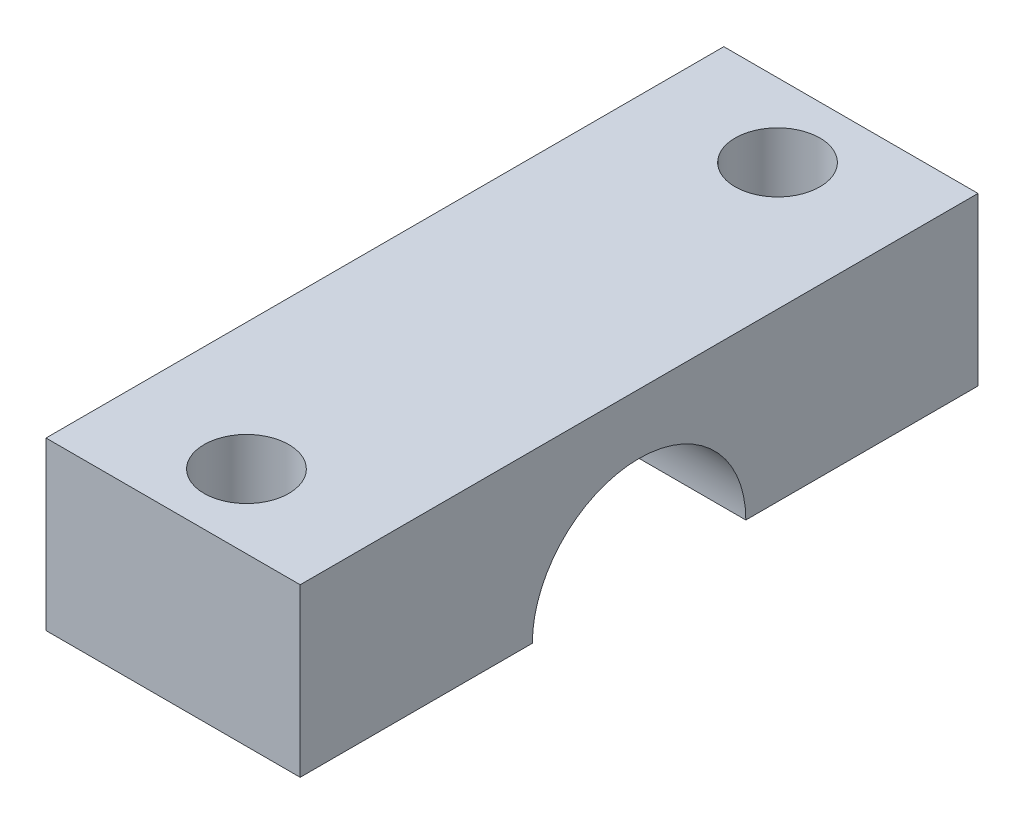
ISO-10303-21;
HEADER;
FILE_DESCRIPTION(('STEP AP214'),'2;1');
FILE_NAME('part.step','',(''),(''),'','','');
FILE_SCHEMA(('AUTOMOTIVE_DESIGN { 1 0 10303 214 1 1 1 1 }'));
ENDSEC;
DATA;
#1=APPLICATION_CONTEXT('core data for automotive mechanical design processes');
#2=APPLICATION_PROTOCOL_DEFINITION('international standard','automotive_design',2000,#1);
#3=PRODUCT_CONTEXT('',#1,'mechanical');
#4=PRODUCT('Part','Part','',(#3));
#5=PRODUCT_RELATED_PRODUCT_CATEGORY('part','',(#4));
#6=PRODUCT_DEFINITION_FORMATION('','',#4);
#7=PRODUCT_DEFINITION_CONTEXT('part definition',#1,'design');
#8=PRODUCT_DEFINITION('design','',#6,#7);
#9=PRODUCT_DEFINITION_SHAPE('','',#8);
#10=(LENGTH_UNIT() NAMED_UNIT(*) SI_UNIT(.MILLI.,.METRE.));
#11=(NAMED_UNIT(*) PLANE_ANGLE_UNIT() SI_UNIT($,.RADIAN.));
#12=(NAMED_UNIT(*) SI_UNIT($,.STERADIAN.) SOLID_ANGLE_UNIT());
#13=UNCERTAINTY_MEASURE_WITH_UNIT(LENGTH_MEASURE(1.E-05),#10,'distance_accuracy_value','');
#14=(GEOMETRIC_REPRESENTATION_CONTEXT(3) GLOBAL_UNCERTAINTY_ASSIGNED_CONTEXT((#13)) GLOBAL_UNIT_ASSIGNED_CONTEXT((#10,
#11,#12)) REPRESENTATION_CONTEXT('',''));
#15=CARTESIAN_POINT('',(0.,0.,0.));
#16=DIRECTION('',(0.,0.,1.));
#17=DIRECTION('',(1.,0.,0.));
#18=AXIS2_PLACEMENT_3D('',#15,#16,#17);
#19=CARTESIAN_POINT('',(9.525,6.25,-12.7));
#20=DIRECTION('',(0.,0.,1.));
#21=DIRECTION('',(1.,0.,0.));
#22=AXIS2_PLACEMENT_3D('',#19,#20,#21);
#23=PLANE('',#22);
#24=DIRECTION('',(0.,1.,0.));
#25=VECTOR('',#24,1.);
#26=CARTESIAN_POINT('',(0.,6.25,-12.7));
#27=LINE('',#26,#25);
#28=CARTESIAN_POINT('',(0.,0.,-12.7));
#29=VERTEX_POINT('',#28);
#30=CARTESIAN_POINT('',(0.,6.25,-12.7));
#31=VERTEX_POINT('',#30);
#32=EDGE_CURVE('E117',#29,#31,#27,.T.);
#33=ORIENTED_EDGE('',*,*,#32,.T.);
#34=DIRECTION('',(-1.,0.,0.));
#35=VECTOR('',#34,1.);
#36=CARTESIAN_POINT('',(9.525,6.25,-12.7));
#37=LINE('',#36,#35);
#38=CARTESIAN_POINT('',(9.525,6.25,-12.7));
#39=VERTEX_POINT('',#38);
#40=EDGE_CURVE('E11',#39,#31,#37,.T.);
#41=ORIENTED_EDGE('',*,*,#40,.F.);
#42=DIRECTION('',(0.,1.,0.));
#43=VECTOR('',#42,1.);
#44=CARTESIAN_POINT('',(9.525,6.25,-12.7));
#45=LINE('',#44,#43);
#46=CARTESIAN_POINT('',(9.525,0.,-12.7));
#47=VERTEX_POINT('',#46);
#48=EDGE_CURVE('E128',#47,#39,#45,.T.);
#49=ORIENTED_EDGE('',*,*,#48,.F.);
#50=DIRECTION('',(-1.,0.,0.));
#51=VECTOR('',#50,1.);
#52=CARTESIAN_POINT('',(9.525,0.,-12.7));
#53=LINE('',#52,#51);
#54=EDGE_CURVE('E113',#47,#29,#53,.T.);
#55=ORIENTED_EDGE('',*,*,#54,.T.);
#56=EDGE_LOOP('',(#33,#41,#49,#55));
#57=FACE_BOUND('',#56,.T.);
#58=ADVANCED_FACE('F33',(#57),#23,.F.);
#59=CARTESIAN_POINT('',(9.525,6.25,-12.7));
#60=DIRECTION('',(0.,-1.,0.));
#61=DIRECTION('',(0.,0.,-1.));
#62=AXIS2_PLACEMENT_3D('',#59,#60,#61);
#63=PLANE('',#62);
#64=CARTESIAN_POINT('',(4.7625,6.25,-9.95));
#65=DIRECTION('',(0.,1.,0.));
#66=DIRECTION('',(0.,0.,1.));
#67=AXIS2_PLACEMENT_3D('',#64,#65,#66);
#68=CIRCLE('',#67,1.5875);
#69=CARTESIAN_POINT('',(4.7625,6.25,-8.3625));
#70=VERTEX_POINT('',#69);
#71=EDGE_CURVE('E181',#70,#70,#68,.T.);
#72=ORIENTED_EDGE('',*,*,#71,.F.);
#73=EDGE_LOOP('',(#72));
#74=FACE_BOUND('',#73,.T.);
#75=CARTESIAN_POINT('',(4.7625,6.25,9.95));
#76=DIRECTION('',(0.,1.,0.));
#77=DIRECTION('',(0.,0.,1.));
#78=AXIS2_PLACEMENT_3D('',#75,#76,#77);
#79=CIRCLE('',#78,1.5875);
#80=CARTESIAN_POINT('',(4.7625,6.25,11.5375));
#81=VERTEX_POINT('',#80);
#82=EDGE_CURVE('E175',#81,#81,#79,.T.);
#83=ORIENTED_EDGE('',*,*,#82,.F.);
#84=EDGE_LOOP('',(#83));
#85=FACE_BOUND('',#84,.T.);
#86=DIRECTION('',(0.,0.,1.));
#87=VECTOR('',#86,1.);
#88=CARTESIAN_POINT('',(0.,6.25,-12.7));
#89=LINE('',#88,#87);
#90=CARTESIAN_POINT('',(0.,6.25,12.7));
#91=VERTEX_POINT('',#90);
#92=EDGE_CURVE('E120',#31,#91,#89,.T.);
#93=ORIENTED_EDGE('',*,*,#92,.T.);
#94=DIRECTION('',(-1.,0.,0.));
#95=VECTOR('',#94,1.);
#96=CARTESIAN_POINT('',(9.525,6.25,12.7));
#97=LINE('',#96,#95);
#98=CARTESIAN_POINT('',(9.525,6.25,12.7));
#99=VERTEX_POINT('',#98);
#100=EDGE_CURVE('E41',#99,#91,#97,.T.);
#101=ORIENTED_EDGE('',*,*,#100,.F.);
#102=DIRECTION('',(0.,0.,1.));
#103=VECTOR('',#102,1.);
#104=CARTESIAN_POINT('',(9.525,6.25,-12.7));
#105=LINE('',#104,#103);
#106=EDGE_CURVE('E86',#39,#99,#105,.T.);
#107=ORIENTED_EDGE('',*,*,#106,.F.);
#108=ORIENTED_EDGE('',*,*,#40,.T.);
#109=EDGE_LOOP('',(#93,#101,#107,#108));
#110=FACE_BOUND('',#109,.T.);
#111=ADVANCED_FACE('F156',(#74,#85,#110),#63,.F.);
#112=CARTESIAN_POINT('',(9.525,6.25,12.7));
#113=DIRECTION('',(0.,0.,-1.));
#114=DIRECTION('',(-1.,0.,0.));
#115=AXIS2_PLACEMENT_3D('',#112,#113,#114);
#116=PLANE('',#115);
#117=DIRECTION('',(0.,-1.,0.));
#118=VECTOR('',#117,1.);
#119=CARTESIAN_POINT('',(0.,6.25,12.7));
#120=LINE('',#119,#118);
#121=CARTESIAN_POINT('',(0.,0.,12.7));
#122=VERTEX_POINT('',#121);
#123=EDGE_CURVE('E123',#91,#122,#120,.T.);
#124=ORIENTED_EDGE('',*,*,#123,.T.);
#125=DIRECTION('',(-1.,0.,0.));
#126=VECTOR('',#125,1.);
#127=CARTESIAN_POINT('',(9.525,0.,12.7));
#128=LINE('',#127,#126);
#129=CARTESIAN_POINT('',(9.525,0.,12.7));
#130=VERTEX_POINT('',#129);
#131=EDGE_CURVE('E108',#130,#122,#128,.T.);
#132=ORIENTED_EDGE('',*,*,#131,.F.);
#133=DIRECTION('',(0.,-1.,0.));
#134=VECTOR('',#133,1.);
#135=CARTESIAN_POINT('',(9.525,6.25,12.7));
#136=LINE('',#135,#134);
#137=EDGE_CURVE('E99',#99,#130,#136,.T.);
#138=ORIENTED_EDGE('',*,*,#137,.F.);
#139=ORIENTED_EDGE('',*,*,#100,.T.);
#140=EDGE_LOOP('',(#124,#132,#138,#139));
#141=FACE_BOUND('',#140,.T.);
#142=ADVANCED_FACE('F134',(#141),#116,.F.);
#143=CARTESIAN_POINT('',(9.525,0.,4.));
#144=DIRECTION('',(0.,1.,0.));
#145=DIRECTION('',(0.,0.,1.));
#146=AXIS2_PLACEMENT_3D('',#143,#144,#145);
#147=PLANE('',#146);
#148=CARTESIAN_POINT('',(4.7625,0.,9.95));
#149=DIRECTION('',(0.,1.,0.));
#150=DIRECTION('',(0.,0.,1.));
#151=AXIS2_PLACEMENT_3D('',#148,#149,#150);
#152=CIRCLE('',#151,1.5875);
#153=CARTESIAN_POINT('',(4.7625,0.,11.5375));
#154=VERTEX_POINT('',#153);
#155=EDGE_CURVE('E121',#154,#154,#152,.T.);
#156=ORIENTED_EDGE('',*,*,#155,.T.);
#157=EDGE_LOOP('',(#156));
#158=FACE_BOUND('',#157,.T.);
#159=DIRECTION('',(0.,0.,-1.));
#160=VECTOR('',#159,1.);
#161=CARTESIAN_POINT('',(0.,0.,4.));
#162=LINE('',#161,#160);
#163=CARTESIAN_POINT('',(0.,0.,4.));
#164=VERTEX_POINT('',#163);
#165=EDGE_CURVE('E107',#122,#164,#162,.T.);
#166=ORIENTED_EDGE('',*,*,#165,.T.);
#167=DIRECTION('',(-1.,0.,0.));
#168=VECTOR('',#167,1.);
#169=CARTESIAN_POINT('',(9.525,0.,4.));
#170=LINE('',#169,#168);
#171=CARTESIAN_POINT('',(9.525,0.,4.));
#172=VERTEX_POINT('',#171);
#173=EDGE_CURVE('E104',#172,#164,#170,.T.);
#174=ORIENTED_EDGE('',*,*,#173,.F.);
#175=DIRECTION('',(0.,0.,-1.));
#176=VECTOR('',#175,1.);
#177=CARTESIAN_POINT('',(9.525,0.,4.));
#178=LINE('',#177,#176);
#179=EDGE_CURVE('E93',#130,#172,#178,.T.);
#180=ORIENTED_EDGE('',*,*,#179,.F.);
#181=ORIENTED_EDGE('',*,*,#131,.T.);
#182=EDGE_LOOP('',(#166,#174,#180,#181));
#183=FACE_BOUND('',#182,.T.);
#184=ADVANCED_FACE('F105',(#158,#183),#147,.F.);
#185=CARTESIAN_POINT('',(9.525,0.,0.));
#186=DIRECTION('',(-1.,0.,0.));
#187=DIRECTION('',(0.,0.,1.));
#188=AXIS2_PLACEMENT_3D('',#185,#186,#187);
#189=CYLINDRICAL_SURFACE('',#188,4.);
#190=CARTESIAN_POINT('',(0.,0.,0.));
#191=DIRECTION('',(-1.,0.,0.));
#192=DIRECTION('',(0.,0.,-1.));
#193=AXIS2_PLACEMENT_3D('',#190,#191,#192);
#194=CIRCLE('',#193,4.);
#195=CARTESIAN_POINT('',(0.,0.,-4.));
#196=VERTEX_POINT('',#195);
#197=EDGE_CURVE('E72',#164,#196,#194,.T.);
#198=ORIENTED_EDGE('',*,*,#197,.T.);
#199=DIRECTION('',(-1.,0.,0.));
#200=VECTOR('',#199,1.);
#201=CARTESIAN_POINT('',(9.525,0.,-4.));
#202=LINE('',#201,#200);
#203=CARTESIAN_POINT('',(9.525,0.,-4.));
#204=VERTEX_POINT('',#203);
#205=EDGE_CURVE('E109',#204,#196,#202,.T.);
#206=ORIENTED_EDGE('',*,*,#205,.F.);
#207=CARTESIAN_POINT('',(9.525,0.,0.));
#208=DIRECTION('',(-1.,0.,0.));
#209=DIRECTION('',(0.,0.,-1.));
#210=AXIS2_PLACEMENT_3D('',#207,#208,#209);
#211=CIRCLE('',#210,4.);
#212=EDGE_CURVE('E97',#172,#204,#211,.T.);
#213=ORIENTED_EDGE('',*,*,#212,.F.);
#214=ORIENTED_EDGE('',*,*,#173,.T.);
#215=EDGE_LOOP('',(#198,#206,#213,#214));
#216=FACE_BOUND('',#215,.T.);
#217=ADVANCED_FACE('F111',(#216),#189,.F.);
#218=CARTESIAN_POINT('',(9.525,0.,-12.7));
#219=DIRECTION('',(0.,1.,0.));
#220=DIRECTION('',(0.,0.,1.));
#221=AXIS2_PLACEMENT_3D('',#218,#219,#220);
#222=PLANE('',#221);
#223=CARTESIAN_POINT('',(4.7625,0.,-9.95));
#224=DIRECTION('',(0.,1.,0.));
#225=DIRECTION('',(0.,0.,1.));
#226=AXIS2_PLACEMENT_3D('',#223,#224,#225);
#227=CIRCLE('',#226,1.5875);
#228=CARTESIAN_POINT('',(4.7625,0.,-8.3625));
#229=VERTEX_POINT('',#228);
#230=EDGE_CURVE('E178',#229,#229,#227,.T.);
#231=ORIENTED_EDGE('',*,*,#230,.T.);
#232=EDGE_LOOP('',(#231));
#233=FACE_BOUND('',#232,.T.);
#234=DIRECTION('',(0.,0.,-1.));
#235=VECTOR('',#234,1.);
#236=CARTESIAN_POINT('',(0.,0.,-12.7));
#237=LINE('',#236,#235);
#238=EDGE_CURVE('E78',#196,#29,#237,.T.);
#239=ORIENTED_EDGE('',*,*,#238,.T.);
#240=ORIENTED_EDGE('',*,*,#54,.F.);
#241=DIRECTION('',(0.,0.,-1.));
#242=VECTOR('',#241,1.);
#243=CARTESIAN_POINT('',(9.525,0.,-12.7));
#244=LINE('',#243,#242);
#245=EDGE_CURVE('E49',#204,#47,#244,.T.);
#246=ORIENTED_EDGE('',*,*,#245,.F.);
#247=ORIENTED_EDGE('',*,*,#205,.T.);
#248=EDGE_LOOP('',(#239,#240,#246,#247));
#249=FACE_BOUND('',#248,.T.);
#250=ADVANCED_FACE('F141',(#233,#249),#222,.F.);
#251=CARTESIAN_POINT('',(9.525,0.,0.));
#252=DIRECTION('',(1.,0.,0.));
#253=DIRECTION('',(0.,0.,-1.));
#254=AXIS2_PLACEMENT_3D('',#251,#252,#253);
#255=PLANE('',#254);
#256=ORIENTED_EDGE('',*,*,#48,.T.);
#257=ORIENTED_EDGE('',*,*,#106,.T.);
#258=ORIENTED_EDGE('',*,*,#137,.T.);
#259=ORIENTED_EDGE('',*,*,#179,.T.);
#260=ORIENTED_EDGE('',*,*,#212,.T.);
#261=ORIENTED_EDGE('',*,*,#245,.T.);
#262=EDGE_LOOP('',(#256,#257,#258,#259,#260,#261));
#263=FACE_BOUND('',#262,.T.);
#264=ADVANCED_FACE('F95',(#263),#255,.T.);
#265=CARTESIAN_POINT('',(0.,0.,0.));
#266=DIRECTION('',(1.,0.,0.));
#267=DIRECTION('',(0.,0.,-1.));
#268=AXIS2_PLACEMENT_3D('',#265,#266,#267);
#269=PLANE('',#268);
#270=ORIENTED_EDGE('',*,*,#32,.F.);
#271=ORIENTED_EDGE('',*,*,#238,.F.);
#272=ORIENTED_EDGE('',*,*,#197,.F.);
#273=ORIENTED_EDGE('',*,*,#165,.F.);
#274=ORIENTED_EDGE('',*,*,#123,.F.);
#275=ORIENTED_EDGE('',*,*,#92,.F.);
#276=EDGE_LOOP('',(#270,#271,#272,#273,#274,#275));
#277=FACE_BOUND('',#276,.T.);
#278=ADVANCED_FACE('F137',(#277),#269,.F.);
#279=CARTESIAN_POINT('',(4.7625,0.,9.95));
#280=DIRECTION('',(0.,1.,0.));
#281=DIRECTION('',(0.,0.,1.));
#282=AXIS2_PLACEMENT_3D('',#279,#280,#281);
#283=CYLINDRICAL_SURFACE('',#282,1.5875);
#284=ORIENTED_EDGE('',*,*,#155,.F.);
#285=EDGE_LOOP('',(#284));
#286=FACE_BOUND('',#285,.T.);
#287=ORIENTED_EDGE('',*,*,#82,.T.);
#288=EDGE_LOOP('',(#287));
#289=FACE_BOUND('',#288,.T.);
#290=ADVANCED_FACE('F191',(#286,#289),#283,.F.);
#291=CARTESIAN_POINT('',(4.7625,0.,-9.95));
#292=DIRECTION('',(0.,1.,0.));
#293=DIRECTION('',(0.,0.,1.));
#294=AXIS2_PLACEMENT_3D('',#291,#292,#293);
#295=CYLINDRICAL_SURFACE('',#294,1.5875);
#296=ORIENTED_EDGE('',*,*,#230,.F.);
#297=EDGE_LOOP('',(#296));
#298=FACE_BOUND('',#297,.T.);
#299=ORIENTED_EDGE('',*,*,#71,.T.);
#300=EDGE_LOOP('',(#299));
#301=FACE_BOUND('',#300,.T.);
#302=ADVANCED_FACE('F188',(#298,#301),#295,.F.);
#303=CLOSED_SHELL('',(#58,#111,#142,#184,#217,#250,#264,#278,#290,#302));
#304=MANIFOLD_SOLID_BREP('B2',#303);
#305=ADVANCED_BREP_SHAPE_REPRESENTATION('',(#18,#304),#14);
#306=SHAPE_DEFINITION_REPRESENTATION(#9,#305);
ENDSEC;
END-ISO-10303-21;
